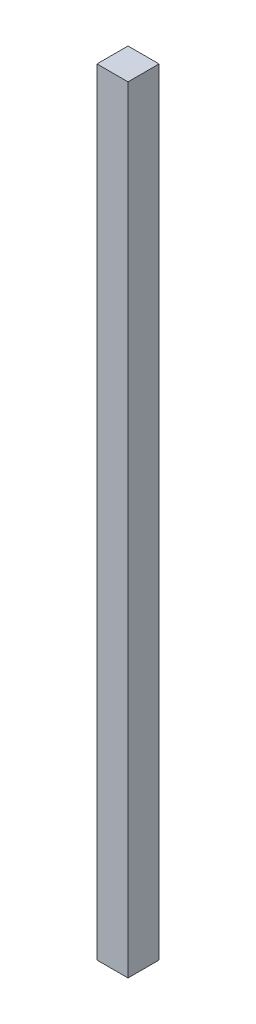
ISO-10303-21;
HEADER;
FILE_DESCRIPTION(('STEP AP214'),'2;1');
FILE_NAME('part.step','',(''),(''),'','','');
FILE_SCHEMA(('AUTOMOTIVE_DESIGN { 1 0 10303 214 1 1 1 1 }'));
ENDSEC;
DATA;
#1=APPLICATION_CONTEXT('core data for automotive mechanical design processes');
#2=APPLICATION_PROTOCOL_DEFINITION('international standard','automotive_design',2000,#1);
#3=PRODUCT_CONTEXT('',#1,'mechanical');
#4=PRODUCT('Part','Part','',(#3));
#5=PRODUCT_RELATED_PRODUCT_CATEGORY('part','',(#4));
#6=PRODUCT_DEFINITION_FORMATION('','',#4);
#7=PRODUCT_DEFINITION_CONTEXT('part definition',#1,'design');
#8=PRODUCT_DEFINITION('design','',#6,#7);
#9=PRODUCT_DEFINITION_SHAPE('','',#8);
#10=(LENGTH_UNIT() NAMED_UNIT(*) SI_UNIT(.MILLI.,.METRE.));
#11=(NAMED_UNIT(*) PLANE_ANGLE_UNIT() SI_UNIT($,.RADIAN.));
#12=(NAMED_UNIT(*) SI_UNIT($,.STERADIAN.) SOLID_ANGLE_UNIT());
#13=UNCERTAINTY_MEASURE_WITH_UNIT(LENGTH_MEASURE(1.E-05),#10,'distance_accuracy_value','');
#14=(GEOMETRIC_REPRESENTATION_CONTEXT(3) GLOBAL_UNCERTAINTY_ASSIGNED_CONTEXT((#13)) GLOBAL_UNIT_ASSIGNED_CONTEXT((#10,
#11,#12)) REPRESENTATION_CONTEXT('',''));
#15=CARTESIAN_POINT('',(0.,0.,0.));
#16=DIRECTION('',(0.,0.,1.));
#17=DIRECTION('',(1.,0.,0.));
#18=AXIS2_PLACEMENT_3D('',#15,#16,#17);
#19=CARTESIAN_POINT('',(-10.,250.,10.));
#20=DIRECTION('',(1.,0.,0.));
#21=DIRECTION('',(0.,0.,-1.));
#22=AXIS2_PLACEMENT_3D('',#19,#20,#21);
#23=PLANE('',#22);
#24=DIRECTION('',(0.,0.,1.));
#25=VECTOR('',#24,1.);
#26=CARTESIAN_POINT('',(-10.,-250.,10.));
#27=LINE('',#26,#25);
#28=CARTESIAN_POINT('',(-10.,-250.,-10.));
#29=VERTEX_POINT('',#28);
#30=CARTESIAN_POINT('',(-10.,-250.,10.));
#31=VERTEX_POINT('',#30);
#32=EDGE_CURVE('E96',#29,#31,#27,.T.);
#33=ORIENTED_EDGE('',*,*,#32,.T.);
#34=DIRECTION('',(0.,-1.,0.));
#35=VECTOR('',#34,1.);
#36=CARTESIAN_POINT('',(-10.,250.,10.));
#37=LINE('',#36,#35);
#38=CARTESIAN_POINT('',(-10.,250.,10.));
#39=VERTEX_POINT('',#38);
#40=EDGE_CURVE('E11',#39,#31,#37,.T.);
#41=ORIENTED_EDGE('',*,*,#40,.F.);
#42=DIRECTION('',(0.,0.,1.));
#43=VECTOR('',#42,1.);
#44=CARTESIAN_POINT('',(-10.,250.,10.));
#45=LINE('',#44,#43);
#46=CARTESIAN_POINT('',(-10.,250.,-10.));
#47=VERTEX_POINT('',#46);
#48=EDGE_CURVE('E84',#47,#39,#45,.T.);
#49=ORIENTED_EDGE('',*,*,#48,.F.);
#50=DIRECTION('',(0.,-1.,0.));
#51=VECTOR('',#50,1.);
#52=CARTESIAN_POINT('',(-10.,250.,-10.));
#53=LINE('',#52,#51);
#54=EDGE_CURVE('E92',#47,#29,#53,.T.);
#55=ORIENTED_EDGE('',*,*,#54,.T.);
#56=EDGE_LOOP('',(#33,#41,#49,#55));
#57=FACE_BOUND('',#56,.T.);
#58=ADVANCED_FACE('F33',(#57),#23,.F.);
#59=CARTESIAN_POINT('',(10.,250.,10.));
#60=DIRECTION('',(0.,0.,-1.));
#61=DIRECTION('',(-1.,0.,0.));
#62=AXIS2_PLACEMENT_3D('',#59,#60,#61);
#63=PLANE('',#62);
#64=DIRECTION('',(1.,0.,0.));
#65=VECTOR('',#64,1.);
#66=CARTESIAN_POINT('',(10.,-250.,10.));
#67=LINE('',#66,#65);
#68=CARTESIAN_POINT('',(10.,-250.,10.));
#69=VERTEX_POINT('',#68);
#70=EDGE_CURVE('E88',#31,#69,#67,.T.);
#71=ORIENTED_EDGE('',*,*,#70,.T.);
#72=DIRECTION('',(0.,-1.,0.));
#73=VECTOR('',#72,1.);
#74=CARTESIAN_POINT('',(10.,250.,10.));
#75=LINE('',#74,#73);
#76=CARTESIAN_POINT('',(10.,250.,10.));
#77=VERTEX_POINT('',#76);
#78=EDGE_CURVE('E41',#77,#69,#75,.T.);
#79=ORIENTED_EDGE('',*,*,#78,.F.);
#80=DIRECTION('',(1.,0.,0.));
#81=VECTOR('',#80,1.);
#82=CARTESIAN_POINT('',(10.,250.,10.));
#83=LINE('',#82,#81);
#84=EDGE_CURVE('E79',#39,#77,#83,.T.);
#85=ORIENTED_EDGE('',*,*,#84,.F.);
#86=ORIENTED_EDGE('',*,*,#40,.T.);
#87=EDGE_LOOP('',(#71,#79,#85,#86));
#88=FACE_BOUND('',#87,.T.);
#89=ADVANCED_FACE('F87',(#88),#63,.F.);
#90=CARTESIAN_POINT('',(10.,250.,10.));
#91=DIRECTION('',(-1.,0.,0.));
#92=DIRECTION('',(0.,0.,1.));
#93=AXIS2_PLACEMENT_3D('',#90,#91,#92);
#94=PLANE('',#93);
#95=DIRECTION('',(0.,0.,-1.));
#96=VECTOR('',#95,1.);
#97=CARTESIAN_POINT('',(10.,-250.,10.));
#98=LINE('',#97,#96);
#99=CARTESIAN_POINT('',(10.,-250.,-10.));
#100=VERTEX_POINT('',#99);
#101=EDGE_CURVE('E66',#69,#100,#98,.T.);
#102=ORIENTED_EDGE('',*,*,#101,.T.);
#103=DIRECTION('',(0.,-1.,0.));
#104=VECTOR('',#103,1.);
#105=CARTESIAN_POINT('',(10.,250.,-10.));
#106=LINE('',#105,#104);
#107=CARTESIAN_POINT('',(10.,250.,-10.));
#108=VERTEX_POINT('',#107);
#109=EDGE_CURVE('E89',#108,#100,#106,.T.);
#110=ORIENTED_EDGE('',*,*,#109,.F.);
#111=DIRECTION('',(0.,0.,-1.));
#112=VECTOR('',#111,1.);
#113=CARTESIAN_POINT('',(10.,250.,10.));
#114=LINE('',#113,#112);
#115=EDGE_CURVE('E82',#77,#108,#114,.T.);
#116=ORIENTED_EDGE('',*,*,#115,.F.);
#117=ORIENTED_EDGE('',*,*,#78,.T.);
#118=EDGE_LOOP('',(#102,#110,#116,#117));
#119=FACE_BOUND('',#118,.T.);
#120=ADVANCED_FACE('F90',(#119),#94,.F.);
#121=CARTESIAN_POINT('',(10.,250.,-10.));
#122=DIRECTION('',(0.,0.,1.));
#123=DIRECTION('',(1.,0.,0.));
#124=AXIS2_PLACEMENT_3D('',#121,#122,#123);
#125=PLANE('',#124);
#126=DIRECTION('',(-1.,0.,0.));
#127=VECTOR('',#126,1.);
#128=CARTESIAN_POINT('',(10.,-250.,-10.));
#129=LINE('',#128,#127);
#130=EDGE_CURVE('E72',#100,#29,#129,.T.);
#131=ORIENTED_EDGE('',*,*,#130,.T.);
#132=ORIENTED_EDGE('',*,*,#54,.F.);
#133=DIRECTION('',(-1.,0.,0.));
#134=VECTOR('',#133,1.);
#135=CARTESIAN_POINT('',(10.,250.,-10.));
#136=LINE('',#135,#134);
#137=EDGE_CURVE('E49',#108,#47,#136,.T.);
#138=ORIENTED_EDGE('',*,*,#137,.F.);
#139=ORIENTED_EDGE('',*,*,#109,.T.);
#140=EDGE_LOOP('',(#131,#132,#138,#139));
#141=FACE_BOUND('',#140,.T.);
#142=ADVANCED_FACE('F103',(#141),#125,.F.);
#143=CARTESIAN_POINT('',(0.,250.,0.));
#144=DIRECTION('',(0.,1.,0.));
#145=DIRECTION('',(0.,0.,1.));
#146=AXIS2_PLACEMENT_3D('',#143,#144,#145);
#147=PLANE('',#146);
#148=ORIENTED_EDGE('',*,*,#48,.T.);
#149=ORIENTED_EDGE('',*,*,#84,.T.);
#150=ORIENTED_EDGE('',*,*,#115,.T.);
#151=ORIENTED_EDGE('',*,*,#137,.T.);
#152=EDGE_LOOP('',(#148,#149,#150,#151));
#153=FACE_BOUND('',#152,.T.);
#154=ADVANCED_FACE('F80',(#153),#147,.T.);
#155=CARTESIAN_POINT('',(0.,-250.,0.));
#156=DIRECTION('',(0.,1.,0.));
#157=DIRECTION('',(0.,0.,1.));
#158=AXIS2_PLACEMENT_3D('',#155,#156,#157);
#159=PLANE('',#158);
#160=ORIENTED_EDGE('',*,*,#32,.F.);
#161=ORIENTED_EDGE('',*,*,#130,.F.);
#162=ORIENTED_EDGE('',*,*,#101,.F.);
#163=ORIENTED_EDGE('',*,*,#70,.F.);
#164=EDGE_LOOP('',(#160,#161,#162,#163));
#165=FACE_BOUND('',#164,.T.);
#166=ADVANCED_FACE('F106',(#165),#159,.F.);
#167=CLOSED_SHELL('',(#58,#89,#120,#142,#154,#166));
#168=MANIFOLD_SOLID_BREP('B2',#167);
#169=ADVANCED_BREP_SHAPE_REPRESENTATION('',(#18,#168),#14);
#170=SHAPE_DEFINITION_REPRESENTATION(#9,#169);
ENDSEC;
END-ISO-10303-21;
